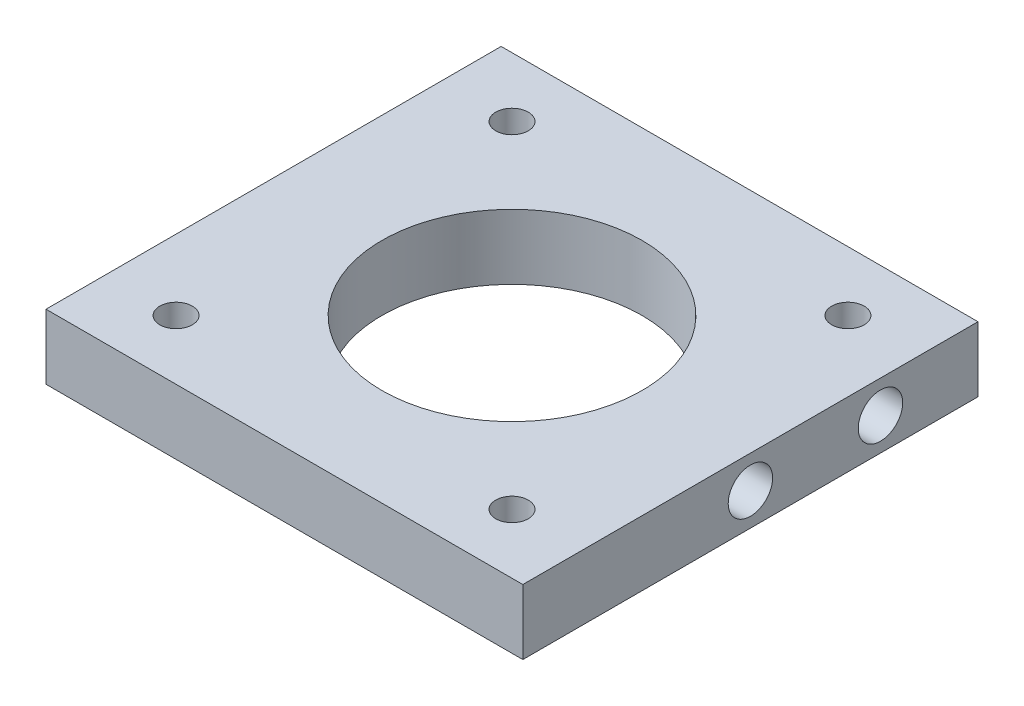
ISO-10303-21;
HEADER;
FILE_DESCRIPTION(('STEP AP214'),'2;1');
FILE_NAME('part.step','',(''),(''),'','','');
FILE_SCHEMA(('AUTOMOTIVE_DESIGN { 1 0 10303 214 1 1 1 1 }'));
ENDSEC;
DATA;
#1=APPLICATION_CONTEXT('core data for automotive mechanical design processes');
#2=APPLICATION_PROTOCOL_DEFINITION('international standard','automotive_design',2000,#1);
#3=PRODUCT_CONTEXT('',#1,'mechanical');
#4=PRODUCT('Part','Part','',(#3));
#5=PRODUCT_RELATED_PRODUCT_CATEGORY('part','',(#4));
#6=PRODUCT_DEFINITION_FORMATION('','',#4);
#7=PRODUCT_DEFINITION_CONTEXT('part definition',#1,'design');
#8=PRODUCT_DEFINITION('design','',#6,#7);
#9=PRODUCT_DEFINITION_SHAPE('','',#8);
#10=(LENGTH_UNIT() NAMED_UNIT(*) SI_UNIT(.MILLI.,.METRE.));
#11=(NAMED_UNIT(*) PLANE_ANGLE_UNIT() SI_UNIT($,.RADIAN.));
#12=(NAMED_UNIT(*) SI_UNIT($,.STERADIAN.) SOLID_ANGLE_UNIT());
#13=UNCERTAINTY_MEASURE_WITH_UNIT(LENGTH_MEASURE(1.E-05),#10,'distance_accuracy_value','');
#14=(GEOMETRIC_REPRESENTATION_CONTEXT(3) GLOBAL_UNCERTAINTY_ASSIGNED_CONTEXT((#13)) GLOBAL_UNIT_ASSIGNED_CONTEXT((#10,
#11,#12)) REPRESENTATION_CONTEXT('',''));
#15=CARTESIAN_POINT('',(0.,0.,0.));
#16=DIRECTION('',(0.,0.,1.));
#17=DIRECTION('',(1.,0.,0.));
#18=AXIS2_PLACEMENT_3D('',#15,#16,#17);
#19=CARTESIAN_POINT('',(-22.,3.,42.));
#20=DIRECTION('',(0.,1.,0.));
#21=DIRECTION('',(0.,0.,1.));
#22=AXIS2_PLACEMENT_3D('',#19,#20,#21);
#23=PLANE('',#22);
#24=CARTESIAN_POINT('',(-15.5,3.,36.5));
#25=DIRECTION('',(0.,1.,0.));
#26=DIRECTION('',(0.,0.,1.));
#27=AXIS2_PLACEMENT_3D('',#24,#25,#26);
#28=CIRCLE('',#27,1.5);
#29=CARTESIAN_POINT('',(-15.5,3.,38.));
#30=VERTEX_POINT('',#29);
#31=EDGE_CURVE('E146',#30,#30,#28,.T.);
#32=ORIENTED_EDGE('',*,*,#31,.F.);
#33=EDGE_LOOP('',(#32));
#34=FACE_BOUND('',#33,.T.);
#35=CARTESIAN_POINT('',(15.5,3.,36.5));
#36=DIRECTION('',(0.,1.,0.));
#37=DIRECTION('',(0.,0.,1.));
#38=AXIS2_PLACEMENT_3D('',#35,#36,#37);
#39=CIRCLE('',#38,1.5);
#40=CARTESIAN_POINT('',(15.5,3.,38.));
#41=VERTEX_POINT('',#40);
#42=EDGE_CURVE('E171',#41,#41,#39,.T.);
#43=ORIENTED_EDGE('',*,*,#42,.F.);
#44=EDGE_LOOP('',(#43));
#45=FACE_BOUND('',#44,.T.);
#46=CARTESIAN_POINT('',(15.5,3.,5.5));
#47=DIRECTION('',(0.,1.,0.));
#48=DIRECTION('',(0.,0.,1.));
#49=AXIS2_PLACEMENT_3D('',#46,#47,#48);
#50=CIRCLE('',#49,1.5);
#51=CARTESIAN_POINT('',(15.5,3.,7.));
#52=VERTEX_POINT('',#51);
#53=EDGE_CURVE('E165',#52,#52,#50,.T.);
#54=ORIENTED_EDGE('',*,*,#53,.F.);
#55=EDGE_LOOP('',(#54));
#56=FACE_BOUND('',#55,.T.);
#57=CARTESIAN_POINT('',(-15.5,3.,5.5));
#58=DIRECTION('',(0.,1.,0.));
#59=DIRECTION('',(0.,0.,1.));
#60=AXIS2_PLACEMENT_3D('',#57,#58,#59);
#61=CIRCLE('',#60,1.5);
#62=CARTESIAN_POINT('',(-15.5,3.,7.));
#63=VERTEX_POINT('',#62);
#64=EDGE_CURVE('E157',#63,#63,#61,.T.);
#65=ORIENTED_EDGE('',*,*,#64,.F.);
#66=EDGE_LOOP('',(#65));
#67=FACE_BOUND('',#66,.T.);
#68=CARTESIAN_POINT('',(0.,3.,21.));
#69=DIRECTION('',(0.,1.,0.));
#70=DIRECTION('',(0.,0.,1.));
#71=AXIS2_PLACEMENT_3D('',#68,#69,#70);
#72=CIRCLE('',#71,12.);
#73=CARTESIAN_POINT('',(0.,3.,33.));
#74=VERTEX_POINT('',#73);
#75=EDGE_CURVE('E164',#74,#74,#72,.T.);
#76=ORIENTED_EDGE('',*,*,#75,.F.);
#77=EDGE_LOOP('',(#76));
#78=FACE_BOUND('',#77,.T.);
#79=DIRECTION('',(1.,0.,0.));
#80=VECTOR('',#79,1.);
#81=CARTESIAN_POINT('',(-22.,3.,0.));
#82=LINE('',#81,#80);
#83=CARTESIAN_POINT('',(-22.,3.,0.));
#84=VERTEX_POINT('',#83);
#85=CARTESIAN_POINT('',(22.,3.,0.));
#86=VERTEX_POINT('',#85);
#87=EDGE_CURVE('E98',#84,#86,#82,.T.);
#88=ORIENTED_EDGE('',*,*,#87,.F.);
#89=DIRECTION('',(0.,0.,-1.));
#90=VECTOR('',#89,1.);
#91=CARTESIAN_POINT('',(-22.,3.,42.));
#92=LINE('',#91,#90);
#93=CARTESIAN_POINT('',(-22.,3.,42.));
#94=VERTEX_POINT('',#93);
#95=EDGE_CURVE('E11',#94,#84,#92,.T.);
#96=ORIENTED_EDGE('',*,*,#95,.F.);
#97=DIRECTION('',(1.,0.,0.));
#98=VECTOR('',#97,1.);
#99=CARTESIAN_POINT('',(-22.,3.,42.));
#100=LINE('',#99,#98);
#101=CARTESIAN_POINT('',(22.,3.,42.));
#102=VERTEX_POINT('',#101);
#103=EDGE_CURVE('E91',#94,#102,#100,.T.);
#104=ORIENTED_EDGE('',*,*,#103,.T.);
#105=DIRECTION('',(0.,0.,-1.));
#106=VECTOR('',#105,1.);
#107=CARTESIAN_POINT('',(22.,3.,42.));
#108=LINE('',#107,#106);
#109=EDGE_CURVE('E36',#102,#86,#108,.T.);
#110=ORIENTED_EDGE('',*,*,#109,.T.);
#111=EDGE_LOOP('',(#88,#96,#104,#110));
#112=FACE_BOUND('',#111,.T.);
#113=ADVANCED_FACE('F33',(#34,#45,#56,#67,#78,#112),#23,.T.);
#114=CARTESIAN_POINT('',(-22.,-3.,42.));
#115=DIRECTION('',(-1.,0.,0.));
#116=DIRECTION('',(0.,-1.,0.));
#117=AXIS2_PLACEMENT_3D('',#114,#115,#116);
#118=PLANE('',#117);
#119=CARTESIAN_POINT('',(-22.,0.,9.));
#120=DIRECTION('',(-1.,0.,0.));
#121=DIRECTION('',(0.,-1.,0.));
#122=AXIS2_PLACEMENT_3D('',#119,#120,#121);
#123=CIRCLE('',#122,2.05);
#124=CARTESIAN_POINT('',(-22.,-2.04999999999999,9.));
#125=VERTEX_POINT('',#124);
#126=EDGE_CURVE('E147',#125,#125,#123,.T.);
#127=ORIENTED_EDGE('',*,*,#126,.F.);
#128=EDGE_LOOP('',(#127));
#129=FACE_BOUND('',#128,.T.);
#130=CARTESIAN_POINT('',(-22.,0.,21.));
#131=DIRECTION('',(-1.,0.,0.));
#132=DIRECTION('',(0.,-1.,0.));
#133=AXIS2_PLACEMENT_3D('',#130,#131,#132);
#134=CIRCLE('',#133,2.05);
#135=CARTESIAN_POINT('',(-22.,-2.04999999999999,21.));
#136=VERTEX_POINT('',#135);
#137=EDGE_CURVE('E153',#136,#136,#134,.T.);
#138=ORIENTED_EDGE('',*,*,#137,.F.);
#139=EDGE_LOOP('',(#138));
#140=FACE_BOUND('',#139,.T.);
#141=DIRECTION('',(0.,1.,0.));
#142=VECTOR('',#141,1.);
#143=CARTESIAN_POINT('',(-22.,-3.,0.));
#144=LINE('',#143,#142);
#145=CARTESIAN_POINT('',(-22.,-3.,0.));
#146=VERTEX_POINT('',#145);
#147=EDGE_CURVE('E93',#146,#84,#144,.T.);
#148=ORIENTED_EDGE('',*,*,#147,.F.);
#149=DIRECTION('',(0.,0.,-1.));
#150=VECTOR('',#149,1.);
#151=CARTESIAN_POINT('',(-22.,-3.,42.));
#152=LINE('',#151,#150);
#153=CARTESIAN_POINT('',(-22.,-3.,42.));
#154=VERTEX_POINT('',#153);
#155=EDGE_CURVE('E42',#154,#146,#152,.T.);
#156=ORIENTED_EDGE('',*,*,#155,.F.);
#157=DIRECTION('',(0.,1.,0.));
#158=VECTOR('',#157,1.);
#159=CARTESIAN_POINT('',(-22.,-3.,42.));
#160=LINE('',#159,#158);
#161=EDGE_CURVE('E81',#154,#94,#160,.T.);
#162=ORIENTED_EDGE('',*,*,#161,.T.);
#163=ORIENTED_EDGE('',*,*,#95,.T.);
#164=EDGE_LOOP('',(#148,#156,#162,#163));
#165=FACE_BOUND('',#164,.T.);
#166=ADVANCED_FACE('F109',(#129,#140,#165),#118,.T.);
#167=CARTESIAN_POINT('',(-22.,-3.,42.));
#168=DIRECTION('',(0.,1.,0.));
#169=DIRECTION('',(0.,0.,1.));
#170=AXIS2_PLACEMENT_3D('',#167,#168,#169);
#171=PLANE('',#170);
#172=CARTESIAN_POINT('',(-15.5,-3.,36.5));
#173=DIRECTION('',(0.,1.,0.));
#174=DIRECTION('',(0.,0.,1.));
#175=AXIS2_PLACEMENT_3D('',#172,#173,#174);
#176=CIRCLE('',#175,1.5);
#177=CARTESIAN_POINT('',(-15.5,-3.,38.));
#178=VERTEX_POINT('',#177);
#179=EDGE_CURVE('E174',#178,#178,#176,.F.);
#180=ORIENTED_EDGE('',*,*,#179,.F.);
#181=EDGE_LOOP('',(#180));
#182=FACE_BOUND('',#181,.T.);
#183=CARTESIAN_POINT('',(15.5,-3.,36.5));
#184=DIRECTION('',(0.,1.,0.));
#185=DIRECTION('',(0.,0.,1.));
#186=AXIS2_PLACEMENT_3D('',#183,#184,#185);
#187=CIRCLE('',#186,1.5);
#188=CARTESIAN_POINT('',(15.5,-3.,38.));
#189=VERTEX_POINT('',#188);
#190=EDGE_CURVE('E168',#189,#189,#187,.F.);
#191=ORIENTED_EDGE('',*,*,#190,.F.);
#192=EDGE_LOOP('',(#191));
#193=FACE_BOUND('',#192,.T.);
#194=CARTESIAN_POINT('',(15.5,-3.,5.5));
#195=DIRECTION('',(0.,1.,0.));
#196=DIRECTION('',(0.,0.,1.));
#197=AXIS2_PLACEMENT_3D('',#194,#195,#196);
#198=CIRCLE('',#197,1.5);
#199=CARTESIAN_POINT('',(15.5,-3.,7.));
#200=VERTEX_POINT('',#199);
#201=EDGE_CURVE('E161',#200,#200,#198,.F.);
#202=ORIENTED_EDGE('',*,*,#201,.F.);
#203=EDGE_LOOP('',(#202));
#204=FACE_BOUND('',#203,.T.);
#205=CARTESIAN_POINT('',(-15.5,-3.,5.5));
#206=DIRECTION('',(0.,1.,0.));
#207=DIRECTION('',(0.,0.,1.));
#208=AXIS2_PLACEMENT_3D('',#205,#206,#207);
#209=CIRCLE('',#208,1.5);
#210=CARTESIAN_POINT('',(-15.5,-3.,7.));
#211=VERTEX_POINT('',#210);
#212=EDGE_CURVE('E160',#211,#211,#209,.F.);
#213=ORIENTED_EDGE('',*,*,#212,.F.);
#214=EDGE_LOOP('',(#213));
#215=FACE_BOUND('',#214,.T.);
#216=CARTESIAN_POINT('',(0.,-3.,21.));
#217=DIRECTION('',(0.,1.,0.));
#218=DIRECTION('',(0.,0.,1.));
#219=AXIS2_PLACEMENT_3D('',#216,#217,#218);
#220=CIRCLE('',#219,12.);
#221=CARTESIAN_POINT('',(0.,-3.,33.));
#222=VERTEX_POINT('',#221);
#223=EDGE_CURVE('E102',#222,#222,#220,.F.);
#224=ORIENTED_EDGE('',*,*,#223,.F.);
#225=EDGE_LOOP('',(#224));
#226=FACE_BOUND('',#225,.T.);
#227=DIRECTION('',(1.,0.,0.));
#228=VECTOR('',#227,1.);
#229=CARTESIAN_POINT('',(-22.,-3.,0.));
#230=LINE('',#229,#228);
#231=CARTESIAN_POINT('',(22.,-3.,0.));
#232=VERTEX_POINT('',#231);
#233=EDGE_CURVE('E86',#146,#232,#230,.T.);
#234=ORIENTED_EDGE('',*,*,#233,.T.);
#235=DIRECTION('',(0.,0.,-1.));
#236=VECTOR('',#235,1.);
#237=CARTESIAN_POINT('',(22.,-3.,42.));
#238=LINE('',#237,#236);
#239=CARTESIAN_POINT('',(22.,-3.,42.));
#240=VERTEX_POINT('',#239);
#241=EDGE_CURVE('E84',#240,#232,#238,.T.);
#242=ORIENTED_EDGE('',*,*,#241,.F.);
#243=DIRECTION('',(1.,0.,0.));
#244=VECTOR('',#243,1.);
#245=CARTESIAN_POINT('',(-22.,-3.,42.));
#246=LINE('',#245,#244);
#247=EDGE_CURVE('E78',#154,#240,#246,.T.);
#248=ORIENTED_EDGE('',*,*,#247,.F.);
#249=ORIENTED_EDGE('',*,*,#155,.T.);
#250=EDGE_LOOP('',(#234,#242,#248,#249));
#251=FACE_BOUND('',#250,.T.);
#252=ADVANCED_FACE('F85',(#182,#193,#204,#215,#226,#251),#171,.F.);
#253=CARTESIAN_POINT('',(22.,-3.,42.));
#254=DIRECTION('',(-1.,0.,0.));
#255=DIRECTION('',(0.,-1.,0.));
#256=AXIS2_PLACEMENT_3D('',#253,#254,#255);
#257=PLANE('',#256);
#258=CARTESIAN_POINT('',(22.,0.,9.));
#259=DIRECTION('',(1.,0.,0.));
#260=DIRECTION('',(0.,1.,0.));
#261=AXIS2_PLACEMENT_3D('',#258,#259,#260);
#262=CIRCLE('',#261,2.05);
#263=CARTESIAN_POINT('',(22.,2.04999999999999,9.));
#264=VERTEX_POINT('',#263);
#265=EDGE_CURVE('E132',#264,#264,#262,.T.);
#266=ORIENTED_EDGE('',*,*,#265,.F.);
#267=EDGE_LOOP('',(#266));
#268=FACE_BOUND('',#267,.T.);
#269=CARTESIAN_POINT('',(22.,0.,21.));
#270=DIRECTION('',(1.,0.,0.));
#271=DIRECTION('',(0.,1.,0.));
#272=AXIS2_PLACEMENT_3D('',#269,#270,#271);
#273=CIRCLE('',#272,2.05);
#274=CARTESIAN_POINT('',(22.,2.04999999999999,21.));
#275=VERTEX_POINT('',#274);
#276=EDGE_CURVE('E135',#275,#275,#273,.T.);
#277=ORIENTED_EDGE('',*,*,#276,.F.);
#278=EDGE_LOOP('',(#277));
#279=FACE_BOUND('',#278,.T.);
#280=DIRECTION('',(0.,1.,0.));
#281=VECTOR('',#280,1.);
#282=CARTESIAN_POINT('',(22.,-3.,0.));
#283=LINE('',#282,#281);
#284=EDGE_CURVE('E101',#232,#86,#283,.T.);
#285=ORIENTED_EDGE('',*,*,#284,.T.);
#286=ORIENTED_EDGE('',*,*,#109,.F.);
#287=DIRECTION('',(0.,1.,0.));
#288=VECTOR('',#287,1.);
#289=CARTESIAN_POINT('',(22.,-3.,42.));
#290=LINE('',#289,#288);
#291=EDGE_CURVE('E75',#240,#102,#290,.T.);
#292=ORIENTED_EDGE('',*,*,#291,.F.);
#293=ORIENTED_EDGE('',*,*,#241,.T.);
#294=EDGE_LOOP('',(#285,#286,#292,#293));
#295=FACE_BOUND('',#294,.T.);
#296=ADVANCED_FACE('F90',(#268,#279,#295),#257,.F.);
#297=CARTESIAN_POINT('',(0.,0.,42.));
#298=DIRECTION('',(0.,0.,1.));
#299=DIRECTION('',(1.,0.,0.));
#300=AXIS2_PLACEMENT_3D('',#297,#298,#299);
#301=PLANE('',#300);
#302=ORIENTED_EDGE('',*,*,#103,.F.);
#303=ORIENTED_EDGE('',*,*,#161,.F.);
#304=ORIENTED_EDGE('',*,*,#247,.T.);
#305=ORIENTED_EDGE('',*,*,#291,.T.);
#306=EDGE_LOOP('',(#302,#303,#304,#305));
#307=FACE_BOUND('',#306,.T.);
#308=ADVANCED_FACE('F80',(#307),#301,.T.);
#309=CARTESIAN_POINT('',(0.,0.,0.));
#310=DIRECTION('',(0.,0.,1.));
#311=DIRECTION('',(1.,0.,0.));
#312=AXIS2_PLACEMENT_3D('',#309,#310,#311);
#313=PLANE('',#312);
#314=ORIENTED_EDGE('',*,*,#87,.T.);
#315=ORIENTED_EDGE('',*,*,#284,.F.);
#316=ORIENTED_EDGE('',*,*,#233,.F.);
#317=ORIENTED_EDGE('',*,*,#147,.T.);
#318=EDGE_LOOP('',(#314,#315,#316,#317));
#319=FACE_BOUND('',#318,.T.);
#320=ADVANCED_FACE('F108',(#319),#313,.F.);
#321=CARTESIAN_POINT('',(0.,-3.001,21.));
#322=DIRECTION('',(0.,1.,0.));
#323=DIRECTION('',(0.,0.,1.));
#324=AXIS2_PLACEMENT_3D('',#321,#322,#323);
#325=CYLINDRICAL_SURFACE('',#324,12.);
#326=CARTESIAN_POINT('',(0.,3.,33.));
#327=CARTESIAN_POINT('',(0.,2.9375,33.));
#328=CARTESIAN_POINT('',(0.,2.875,33.));
#329=CARTESIAN_POINT('',(0.,2.75,33.));
#330=CARTESIAN_POINT('',(0.,2.6875,33.));
#331=CARTESIAN_POINT('',(0.,2.5625,33.));
#332=CARTESIAN_POINT('',(0.,2.5,33.));
#333=CARTESIAN_POINT('',(0.,2.375,33.));
#334=CARTESIAN_POINT('',(0.,2.3125,33.));
#335=CARTESIAN_POINT('',(0.,2.1875,33.));
#336=CARTESIAN_POINT('',(0.,2.125,33.));
#337=CARTESIAN_POINT('',(0.,2.,33.));
#338=CARTESIAN_POINT('',(0.,1.9375,33.));
#339=CARTESIAN_POINT('',(0.,1.8125,33.));
#340=CARTESIAN_POINT('',(0.,1.75,33.));
#341=CARTESIAN_POINT('',(0.,1.625,33.));
#342=CARTESIAN_POINT('',(0.,1.5625,33.));
#343=CARTESIAN_POINT('',(0.,1.4375,33.));
#344=CARTESIAN_POINT('',(0.,1.375,33.));
#345=CARTESIAN_POINT('',(0.,1.25,33.));
#346=CARTESIAN_POINT('',(0.,1.1875,33.));
#347=CARTESIAN_POINT('',(0.,1.0625,33.));
#348=CARTESIAN_POINT('',(0.,0.999999999999999,33.));
#349=CARTESIAN_POINT('',(0.,0.874999999999999,33.));
#350=CARTESIAN_POINT('',(0.,0.812499999999999,33.));
#351=CARTESIAN_POINT('',(0.,0.687499999999999,33.));
#352=CARTESIAN_POINT('',(0.,0.624999999999999,33.));
#353=CARTESIAN_POINT('',(0.,0.499999999999999,33.));
#354=CARTESIAN_POINT('',(0.,0.437499999999999,33.));
#355=CARTESIAN_POINT('',(0.,0.312499999999999,33.));
#356=CARTESIAN_POINT('',(0.,0.249999999999999,33.));
#357=CARTESIAN_POINT('',(0.,0.124999999999999,33.));
#358=CARTESIAN_POINT('',(0.,0.0624999999999992,33.));
#359=CARTESIAN_POINT('',(0.,-0.0625000000000009,33.));
#360=CARTESIAN_POINT('',(0.,-0.125000000000001,33.));
#361=CARTESIAN_POINT('',(0.,-0.250000000000001,33.));
#362=CARTESIAN_POINT('',(0.,-0.312500000000001,33.));
#363=CARTESIAN_POINT('',(0.,-0.437500000000001,33.));
#364=CARTESIAN_POINT('',(0.,-0.500000000000001,33.));
#365=CARTESIAN_POINT('',(0.,-0.625000000000001,33.));
#366=CARTESIAN_POINT('',(0.,-0.687500000000001,33.));
#367=CARTESIAN_POINT('',(0.,-0.812500000000001,33.));
#368=CARTESIAN_POINT('',(0.,-0.875000000000001,33.));
#369=CARTESIAN_POINT('',(0.,-1.,33.));
#370=CARTESIAN_POINT('',(0.,-1.0625,33.));
#371=CARTESIAN_POINT('',(0.,-1.1875,33.));
#372=CARTESIAN_POINT('',(0.,-1.25,33.));
#373=CARTESIAN_POINT('',(0.,-1.375,33.));
#374=CARTESIAN_POINT('',(0.,-1.4375,33.));
#375=CARTESIAN_POINT('',(0.,-1.5625,33.));
#376=CARTESIAN_POINT('',(0.,-1.625,33.));
#377=CARTESIAN_POINT('',(0.,-1.75,33.));
#378=CARTESIAN_POINT('',(0.,-1.8125,33.));
#379=CARTESIAN_POINT('',(0.,-1.9375,33.));
#380=CARTESIAN_POINT('',(0.,-2.,33.));
#381=CARTESIAN_POINT('',(0.,-2.125,33.));
#382=CARTESIAN_POINT('',(0.,-2.1875,33.));
#383=CARTESIAN_POINT('',(0.,-2.3125,33.));
#384=CARTESIAN_POINT('',(0.,-2.375,33.));
#385=CARTESIAN_POINT('',(0.,-2.5,33.));
#386=CARTESIAN_POINT('',(0.,-2.5625,33.));
#387=CARTESIAN_POINT('',(0.,-2.6875,33.));
#388=CARTESIAN_POINT('',(0.,-2.75,33.));
#389=CARTESIAN_POINT('',(0.,-2.875,33.));
#390=CARTESIAN_POINT('',(0.,-2.9375,33.));
#391=CARTESIAN_POINT('',(0.,-3.,33.));
#392=B_SPLINE_CURVE_WITH_KNOTS('',3,(#326,#327,#328,#329,#330,#331,#332,#333,#334,#335,#336,
#337,#338,#339,#340,#341,#342,#343,#344,#345,#346,#347,#348,#349,#350,#351,#352,#353,#354,#355,
#356,#357,#358,#359,#360,#361,#362,#363,#364,#365,#366,#367,#368,#369,#370,#371,#372,#373,#374,
#375,#376,#377,#378,#379,#380,#381,#382,#383,#384,#385,#386,#387,#388,#389,#390,#391),
.UNSPECIFIED.,.F.,.F.,(4,2,2,2,2,2,2,2,2,2,2,2,2,2,2,2,2,2,2,2,2,2,2,2,2,2,2,2,2,2,2,2,4),(0.,
0.1875,0.375,0.5625,0.75,0.9375,1.125,1.3125,1.5,1.6875,1.875,2.0625,2.25,2.4375,2.625,2.8125,
3.,3.1875,3.375,3.5625,3.75,3.9375,4.125,4.3125,4.5,4.6875,4.875,5.0625,5.25,5.4375,5.625,
5.8125,6.),.UNSPECIFIED.);
#393=EDGE_CURVE('BSEAM185',#74,#222,#392,.T.);
#394=ORIENTED_EDGE('',*,*,#75,.T.);
#395=ORIENTED_EDGE('',*,*,#223,.T.);
#396=ORIENTED_EDGE('',*,*,#393,.T.);
#397=ORIENTED_EDGE('',*,*,#393,.F.);
#398=EDGE_LOOP('',(#394,#396,#395,#397));
#399=FACE_BOUND('',#398,.T.);
#400=ADVANCED_FACE('F185',(#399),#325,.F.);
#401=CARTESIAN_POINT('',(-15.5,-3.001,5.5));
#402=DIRECTION('',(0.,1.,0.));
#403=DIRECTION('',(0.,0.,1.));
#404=AXIS2_PLACEMENT_3D('',#401,#402,#403);
#405=CYLINDRICAL_SURFACE('',#404,1.5);
#406=CARTESIAN_POINT('',(-15.5,3.,7.));
#407=CARTESIAN_POINT('',(-15.5,2.9375,7.));
#408=CARTESIAN_POINT('',(-15.5,2.875,7.));
#409=CARTESIAN_POINT('',(-15.5,2.75,7.));
#410=CARTESIAN_POINT('',(-15.5,2.6875,7.));
#411=CARTESIAN_POINT('',(-15.5,2.5625,7.));
#412=CARTESIAN_POINT('',(-15.5,2.5,7.));
#413=CARTESIAN_POINT('',(-15.5,2.375,7.));
#414=CARTESIAN_POINT('',(-15.5,2.3125,7.));
#415=CARTESIAN_POINT('',(-15.5,2.1875,7.));
#416=CARTESIAN_POINT('',(-15.5,2.125,7.));
#417=CARTESIAN_POINT('',(-15.5,2.,7.));
#418=CARTESIAN_POINT('',(-15.5,1.9375,7.));
#419=CARTESIAN_POINT('',(-15.5,1.8125,7.));
#420=CARTESIAN_POINT('',(-15.5,1.75,7.));
#421=CARTESIAN_POINT('',(-15.5,1.625,7.));
#422=CARTESIAN_POINT('',(-15.5,1.5625,7.));
#423=CARTESIAN_POINT('',(-15.5,1.4375,7.));
#424=CARTESIAN_POINT('',(-15.5,1.375,7.));
#425=CARTESIAN_POINT('',(-15.5,1.25,7.));
#426=CARTESIAN_POINT('',(-15.5,1.1875,7.));
#427=CARTESIAN_POINT('',(-15.5,1.0625,7.));
#428=CARTESIAN_POINT('',(-15.5,0.999999999999999,7.));
#429=CARTESIAN_POINT('',(-15.5,0.874999999999999,7.));
#430=CARTESIAN_POINT('',(-15.5,0.812499999999999,7.));
#431=CARTESIAN_POINT('',(-15.5,0.687499999999999,7.));
#432=CARTESIAN_POINT('',(-15.5,0.624999999999999,7.));
#433=CARTESIAN_POINT('',(-15.5,0.499999999999999,7.));
#434=CARTESIAN_POINT('',(-15.5,0.437499999999999,7.));
#435=CARTESIAN_POINT('',(-15.5,0.312499999999999,7.));
#436=CARTESIAN_POINT('',(-15.5,0.249999999999999,7.));
#437=CARTESIAN_POINT('',(-15.5,0.124999999999999,7.));
#438=CARTESIAN_POINT('',(-15.5,0.0624999999999992,7.));
#439=CARTESIAN_POINT('',(-15.5,-0.0625000000000009,7.));
#440=CARTESIAN_POINT('',(-15.5,-0.125000000000001,7.));
#441=CARTESIAN_POINT('',(-15.5,-0.250000000000001,7.));
#442=CARTESIAN_POINT('',(-15.5,-0.312500000000001,7.));
#443=CARTESIAN_POINT('',(-15.5,-0.437500000000001,7.));
#444=CARTESIAN_POINT('',(-15.5,-0.500000000000001,7.));
#445=CARTESIAN_POINT('',(-15.5,-0.625000000000001,7.));
#446=CARTESIAN_POINT('',(-15.5,-0.687500000000001,7.));
#447=CARTESIAN_POINT('',(-15.5,-0.812500000000001,7.));
#448=CARTESIAN_POINT('',(-15.5,-0.875000000000001,7.));
#449=CARTESIAN_POINT('',(-15.5,-1.,7.));
#450=CARTESIAN_POINT('',(-15.5,-1.0625,7.));
#451=CARTESIAN_POINT('',(-15.5,-1.1875,7.));
#452=CARTESIAN_POINT('',(-15.5,-1.25,7.));
#453=CARTESIAN_POINT('',(-15.5,-1.375,7.));
#454=CARTESIAN_POINT('',(-15.5,-1.4375,7.));
#455=CARTESIAN_POINT('',(-15.5,-1.5625,7.));
#456=CARTESIAN_POINT('',(-15.5,-1.625,7.));
#457=CARTESIAN_POINT('',(-15.5,-1.75,7.));
#458=CARTESIAN_POINT('',(-15.5,-1.8125,7.));
#459=CARTESIAN_POINT('',(-15.5,-1.9375,7.));
#460=CARTESIAN_POINT('',(-15.5,-2.,7.));
#461=CARTESIAN_POINT('',(-15.5,-2.125,7.));
#462=CARTESIAN_POINT('',(-15.5,-2.1875,7.));
#463=CARTESIAN_POINT('',(-15.5,-2.3125,7.));
#464=CARTESIAN_POINT('',(-15.5,-2.375,7.));
#465=CARTESIAN_POINT('',(-15.5,-2.5,7.));
#466=CARTESIAN_POINT('',(-15.5,-2.5625,7.));
#467=CARTESIAN_POINT('',(-15.5,-2.6875,7.));
#468=CARTESIAN_POINT('',(-15.5,-2.75,7.));
#469=CARTESIAN_POINT('',(-15.5,-2.875,7.));
#470=CARTESIAN_POINT('',(-15.5,-2.9375,7.));
#471=CARTESIAN_POINT('',(-15.5,-3.,7.));
#472=B_SPLINE_CURVE_WITH_KNOTS('',3,(#406,#407,#408,#409,#410,#411,#412,#413,#414,#415,#416,
#417,#418,#419,#420,#421,#422,#423,#424,#425,#426,#427,#428,#429,#430,#431,#432,#433,#434,#435,
#436,#437,#438,#439,#440,#441,#442,#443,#444,#445,#446,#447,#448,#449,#450,#451,#452,#453,#454,
#455,#456,#457,#458,#459,#460,#461,#462,#463,#464,#465,#466,#467,#468,#469,#470,#471),
.UNSPECIFIED.,.F.,.F.,(4,2,2,2,2,2,2,2,2,2,2,2,2,2,2,2,2,2,2,2,2,2,2,2,2,2,2,2,2,2,2,2,4),(0.,
0.1875,0.375,0.5625,0.75,0.9375,1.125,1.3125,1.5,1.6875,1.875,2.0625,2.25,2.4375,2.625,2.8125,
3.,3.1875,3.375,3.5625,3.75,3.9375,4.125,4.3125,4.5,4.6875,4.875,5.0625,5.25,5.4375,5.625,
5.8125,6.),.UNSPECIFIED.);
#473=EDGE_CURVE('BSEAM188',#63,#211,#472,.T.);
#474=ORIENTED_EDGE('',*,*,#64,.T.);
#475=ORIENTED_EDGE('',*,*,#212,.T.);
#476=ORIENTED_EDGE('',*,*,#473,.T.);
#477=ORIENTED_EDGE('',*,*,#473,.F.);
#478=EDGE_LOOP('',(#474,#476,#475,#477));
#479=FACE_BOUND('',#478,.T.);
#480=ADVANCED_FACE('F188',(#479),#405,.F.);
#481=CARTESIAN_POINT('',(15.5,-3.001,5.5));
#482=DIRECTION('',(0.,1.,0.));
#483=DIRECTION('',(0.,0.,1.));
#484=AXIS2_PLACEMENT_3D('',#481,#482,#483);
#485=CYLINDRICAL_SURFACE('',#484,1.5);
#486=CARTESIAN_POINT('',(15.5,3.,7.));
#487=CARTESIAN_POINT('',(15.5,2.9375,7.));
#488=CARTESIAN_POINT('',(15.5,2.875,7.));
#489=CARTESIAN_POINT('',(15.5,2.75,7.));
#490=CARTESIAN_POINT('',(15.5,2.6875,7.));
#491=CARTESIAN_POINT('',(15.5,2.5625,7.));
#492=CARTESIAN_POINT('',(15.5,2.5,7.));
#493=CARTESIAN_POINT('',(15.5,2.375,7.));
#494=CARTESIAN_POINT('',(15.5,2.3125,7.));
#495=CARTESIAN_POINT('',(15.5,2.1875,7.));
#496=CARTESIAN_POINT('',(15.5,2.125,7.));
#497=CARTESIAN_POINT('',(15.5,2.,7.));
#498=CARTESIAN_POINT('',(15.5,1.9375,7.));
#499=CARTESIAN_POINT('',(15.5,1.8125,7.));
#500=CARTESIAN_POINT('',(15.5,1.75,7.));
#501=CARTESIAN_POINT('',(15.5,1.625,7.));
#502=CARTESIAN_POINT('',(15.5,1.5625,7.));
#503=CARTESIAN_POINT('',(15.5,1.4375,7.));
#504=CARTESIAN_POINT('',(15.5,1.375,7.));
#505=CARTESIAN_POINT('',(15.5,1.25,7.));
#506=CARTESIAN_POINT('',(15.5,1.1875,7.));
#507=CARTESIAN_POINT('',(15.5,1.0625,7.));
#508=CARTESIAN_POINT('',(15.5,0.999999999999999,7.));
#509=CARTESIAN_POINT('',(15.5,0.874999999999999,7.));
#510=CARTESIAN_POINT('',(15.5,0.812499999999999,7.));
#511=CARTESIAN_POINT('',(15.5,0.687499999999999,7.));
#512=CARTESIAN_POINT('',(15.5,0.624999999999999,7.));
#513=CARTESIAN_POINT('',(15.5,0.499999999999999,7.));
#514=CARTESIAN_POINT('',(15.5,0.437499999999999,7.));
#515=CARTESIAN_POINT('',(15.5,0.312499999999999,7.));
#516=CARTESIAN_POINT('',(15.5,0.249999999999999,7.));
#517=CARTESIAN_POINT('',(15.5,0.124999999999999,7.));
#518=CARTESIAN_POINT('',(15.5,0.0624999999999992,7.));
#519=CARTESIAN_POINT('',(15.5,-0.0625000000000009,7.));
#520=CARTESIAN_POINT('',(15.5,-0.125000000000001,7.));
#521=CARTESIAN_POINT('',(15.5,-0.250000000000001,7.));
#522=CARTESIAN_POINT('',(15.5,-0.312500000000001,7.));
#523=CARTESIAN_POINT('',(15.5,-0.437500000000001,7.));
#524=CARTESIAN_POINT('',(15.5,-0.500000000000001,7.));
#525=CARTESIAN_POINT('',(15.5,-0.625000000000001,7.));
#526=CARTESIAN_POINT('',(15.5,-0.687500000000001,7.));
#527=CARTESIAN_POINT('',(15.5,-0.812500000000001,7.));
#528=CARTESIAN_POINT('',(15.5,-0.875000000000001,7.));
#529=CARTESIAN_POINT('',(15.5,-1.,7.));
#530=CARTESIAN_POINT('',(15.5,-1.0625,7.));
#531=CARTESIAN_POINT('',(15.5,-1.1875,7.));
#532=CARTESIAN_POINT('',(15.5,-1.25,7.));
#533=CARTESIAN_POINT('',(15.5,-1.375,7.));
#534=CARTESIAN_POINT('',(15.5,-1.4375,7.));
#535=CARTESIAN_POINT('',(15.5,-1.5625,7.));
#536=CARTESIAN_POINT('',(15.5,-1.625,7.));
#537=CARTESIAN_POINT('',(15.5,-1.75,7.));
#538=CARTESIAN_POINT('',(15.5,-1.8125,7.));
#539=CARTESIAN_POINT('',(15.5,-1.9375,7.));
#540=CARTESIAN_POINT('',(15.5,-2.,7.));
#541=CARTESIAN_POINT('',(15.5,-2.125,7.));
#542=CARTESIAN_POINT('',(15.5,-2.1875,7.));
#543=CARTESIAN_POINT('',(15.5,-2.3125,7.));
#544=CARTESIAN_POINT('',(15.5,-2.375,7.));
#545=CARTESIAN_POINT('',(15.5,-2.5,7.));
#546=CARTESIAN_POINT('',(15.5,-2.5625,7.));
#547=CARTESIAN_POINT('',(15.5,-2.6875,7.));
#548=CARTESIAN_POINT('',(15.5,-2.75,7.));
#549=CARTESIAN_POINT('',(15.5,-2.875,7.));
#550=CARTESIAN_POINT('',(15.5,-2.9375,7.));
#551=CARTESIAN_POINT('',(15.5,-3.,7.));
#552=B_SPLINE_CURVE_WITH_KNOTS('',3,(#486,#487,#488,#489,#490,#491,#492,#493,#494,#495,#496,
#497,#498,#499,#500,#501,#502,#503,#504,#505,#506,#507,#508,#509,#510,#511,#512,#513,#514,#515,
#516,#517,#518,#519,#520,#521,#522,#523,#524,#525,#526,#527,#528,#529,#530,#531,#532,#533,#534,
#535,#536,#537,#538,#539,#540,#541,#542,#543,#544,#545,#546,#547,#548,#549,#550,#551),
.UNSPECIFIED.,.F.,.F.,(4,2,2,2,2,2,2,2,2,2,2,2,2,2,2,2,2,2,2,2,2,2,2,2,2,2,2,2,2,2,2,2,4),(0.,
0.1875,0.375,0.5625,0.75,0.9375,1.125,1.3125,1.5,1.6875,1.875,2.0625,2.25,2.4375,2.625,2.8125,
3.,3.1875,3.375,3.5625,3.75,3.9375,4.125,4.3125,4.5,4.6875,4.875,5.0625,5.25,5.4375,5.625,
5.8125,6.),.UNSPECIFIED.);
#553=EDGE_CURVE('BSEAM195',#52,#200,#552,.T.);
#554=ORIENTED_EDGE('',*,*,#53,.T.);
#555=ORIENTED_EDGE('',*,*,#201,.T.);
#556=ORIENTED_EDGE('',*,*,#553,.T.);
#557=ORIENTED_EDGE('',*,*,#553,.F.);
#558=EDGE_LOOP('',(#554,#556,#555,#557));
#559=FACE_BOUND('',#558,.T.);
#560=ADVANCED_FACE('F195',(#559),#485,.F.);
#561=CARTESIAN_POINT('',(15.5,-3.001,36.5));
#562=DIRECTION('',(0.,1.,0.));
#563=DIRECTION('',(0.,0.,1.));
#564=AXIS2_PLACEMENT_3D('',#561,#562,#563);
#565=CYLINDRICAL_SURFACE('',#564,1.5);
#566=CARTESIAN_POINT('',(15.5,3.,38.));
#567=CARTESIAN_POINT('',(15.5,2.9375,38.));
#568=CARTESIAN_POINT('',(15.5,2.875,38.));
#569=CARTESIAN_POINT('',(15.5,2.75,38.));
#570=CARTESIAN_POINT('',(15.5,2.6875,38.));
#571=CARTESIAN_POINT('',(15.5,2.5625,38.));
#572=CARTESIAN_POINT('',(15.5,2.5,38.));
#573=CARTESIAN_POINT('',(15.5,2.375,38.));
#574=CARTESIAN_POINT('',(15.5,2.3125,38.));
#575=CARTESIAN_POINT('',(15.5,2.1875,38.));
#576=CARTESIAN_POINT('',(15.5,2.125,38.));
#577=CARTESIAN_POINT('',(15.5,2.,38.));
#578=CARTESIAN_POINT('',(15.5,1.9375,38.));
#579=CARTESIAN_POINT('',(15.5,1.8125,38.));
#580=CARTESIAN_POINT('',(15.5,1.75,38.));
#581=CARTESIAN_POINT('',(15.5,1.625,38.));
#582=CARTESIAN_POINT('',(15.5,1.5625,38.));
#583=CARTESIAN_POINT('',(15.5,1.4375,38.));
#584=CARTESIAN_POINT('',(15.5,1.375,38.));
#585=CARTESIAN_POINT('',(15.5,1.25,38.));
#586=CARTESIAN_POINT('',(15.5,1.1875,38.));
#587=CARTESIAN_POINT('',(15.5,1.0625,38.));
#588=CARTESIAN_POINT('',(15.5,0.999999999999999,38.));
#589=CARTESIAN_POINT('',(15.5,0.874999999999999,38.));
#590=CARTESIAN_POINT('',(15.5,0.812499999999999,38.));
#591=CARTESIAN_POINT('',(15.5,0.687499999999999,38.));
#592=CARTESIAN_POINT('',(15.5,0.624999999999999,38.));
#593=CARTESIAN_POINT('',(15.5,0.499999999999999,38.));
#594=CARTESIAN_POINT('',(15.5,0.437499999999999,38.));
#595=CARTESIAN_POINT('',(15.5,0.312499999999999,38.));
#596=CARTESIAN_POINT('',(15.5,0.249999999999999,38.));
#597=CARTESIAN_POINT('',(15.5,0.124999999999999,38.));
#598=CARTESIAN_POINT('',(15.5,0.0624999999999992,38.));
#599=CARTESIAN_POINT('',(15.5,-0.0625000000000009,38.));
#600=CARTESIAN_POINT('',(15.5,-0.125000000000001,38.));
#601=CARTESIAN_POINT('',(15.5,-0.250000000000001,38.));
#602=CARTESIAN_POINT('',(15.5,-0.312500000000001,38.));
#603=CARTESIAN_POINT('',(15.5,-0.437500000000001,38.));
#604=CARTESIAN_POINT('',(15.5,-0.500000000000001,38.));
#605=CARTESIAN_POINT('',(15.5,-0.625000000000001,38.));
#606=CARTESIAN_POINT('',(15.5,-0.687500000000001,38.));
#607=CARTESIAN_POINT('',(15.5,-0.812500000000001,38.));
#608=CARTESIAN_POINT('',(15.5,-0.875000000000001,38.));
#609=CARTESIAN_POINT('',(15.5,-1.,38.));
#610=CARTESIAN_POINT('',(15.5,-1.0625,38.));
#611=CARTESIAN_POINT('',(15.5,-1.1875,38.));
#612=CARTESIAN_POINT('',(15.5,-1.25,38.));
#613=CARTESIAN_POINT('',(15.5,-1.375,38.));
#614=CARTESIAN_POINT('',(15.5,-1.4375,38.));
#615=CARTESIAN_POINT('',(15.5,-1.5625,38.));
#616=CARTESIAN_POINT('',(15.5,-1.625,38.));
#617=CARTESIAN_POINT('',(15.5,-1.75,38.));
#618=CARTESIAN_POINT('',(15.5,-1.8125,38.));
#619=CARTESIAN_POINT('',(15.5,-1.9375,38.));
#620=CARTESIAN_POINT('',(15.5,-2.,38.));
#621=CARTESIAN_POINT('',(15.5,-2.125,38.));
#622=CARTESIAN_POINT('',(15.5,-2.1875,38.));
#623=CARTESIAN_POINT('',(15.5,-2.3125,38.));
#624=CARTESIAN_POINT('',(15.5,-2.375,38.));
#625=CARTESIAN_POINT('',(15.5,-2.5,38.));
#626=CARTESIAN_POINT('',(15.5,-2.5625,38.));
#627=CARTESIAN_POINT('',(15.5,-2.6875,38.));
#628=CARTESIAN_POINT('',(15.5,-2.75,38.));
#629=CARTESIAN_POINT('',(15.5,-2.875,38.));
#630=CARTESIAN_POINT('',(15.5,-2.9375,38.));
#631=CARTESIAN_POINT('',(15.5,-3.,38.));
#632=B_SPLINE_CURVE_WITH_KNOTS('',3,(#566,#567,#568,#569,#570,#571,#572,#573,#574,#575,#576,
#577,#578,#579,#580,#581,#582,#583,#584,#585,#586,#587,#588,#589,#590,#591,#592,#593,#594,#595,
#596,#597,#598,#599,#600,#601,#602,#603,#604,#605,#606,#607,#608,#609,#610,#611,#612,#613,#614,
#615,#616,#617,#618,#619,#620,#621,#622,#623,#624,#625,#626,#627,#628,#629,#630,#631),
.UNSPECIFIED.,.F.,.F.,(4,2,2,2,2,2,2,2,2,2,2,2,2,2,2,2,2,2,2,2,2,2,2,2,2,2,2,2,2,2,2,2,4),(0.,
0.1875,0.375,0.5625,0.75,0.9375,1.125,1.3125,1.5,1.6875,1.875,2.0625,2.25,2.4375,2.625,2.8125,
3.,3.1875,3.375,3.5625,3.75,3.9375,4.125,4.3125,4.5,4.6875,4.875,5.0625,5.25,5.4375,5.625,
5.8125,6.),.UNSPECIFIED.);
#633=EDGE_CURVE('BSEAM203',#41,#189,#632,.T.);
#634=ORIENTED_EDGE('',*,*,#42,.T.);
#635=ORIENTED_EDGE('',*,*,#190,.T.);
#636=ORIENTED_EDGE('',*,*,#633,.T.);
#637=ORIENTED_EDGE('',*,*,#633,.F.);
#638=EDGE_LOOP('',(#634,#636,#635,#637));
#639=FACE_BOUND('',#638,.T.);
#640=ADVANCED_FACE('F203',(#639),#565,.F.);
#641=CARTESIAN_POINT('',(-15.5,-3.001,36.5));
#642=DIRECTION('',(0.,1.,0.));
#643=DIRECTION('',(0.,0.,1.));
#644=AXIS2_PLACEMENT_3D('',#641,#642,#643);
#645=CYLINDRICAL_SURFACE('',#644,1.5);
#646=CARTESIAN_POINT('',(-15.5,3.,38.));
#647=CARTESIAN_POINT('',(-15.5,2.9375,38.));
#648=CARTESIAN_POINT('',(-15.5,2.875,38.));
#649=CARTESIAN_POINT('',(-15.5,2.75,38.));
#650=CARTESIAN_POINT('',(-15.5,2.6875,38.));
#651=CARTESIAN_POINT('',(-15.5,2.5625,38.));
#652=CARTESIAN_POINT('',(-15.5,2.5,38.));
#653=CARTESIAN_POINT('',(-15.5,2.375,38.));
#654=CARTESIAN_POINT('',(-15.5,2.3125,38.));
#655=CARTESIAN_POINT('',(-15.5,2.1875,38.));
#656=CARTESIAN_POINT('',(-15.5,2.125,38.));
#657=CARTESIAN_POINT('',(-15.5,2.,38.));
#658=CARTESIAN_POINT('',(-15.5,1.9375,38.));
#659=CARTESIAN_POINT('',(-15.5,1.8125,38.));
#660=CARTESIAN_POINT('',(-15.5,1.75,38.));
#661=CARTESIAN_POINT('',(-15.5,1.625,38.));
#662=CARTESIAN_POINT('',(-15.5,1.5625,38.));
#663=CARTESIAN_POINT('',(-15.5,1.4375,38.));
#664=CARTESIAN_POINT('',(-15.5,1.375,38.));
#665=CARTESIAN_POINT('',(-15.5,1.25,38.));
#666=CARTESIAN_POINT('',(-15.5,1.1875,38.));
#667=CARTESIAN_POINT('',(-15.5,1.0625,38.));
#668=CARTESIAN_POINT('',(-15.5,0.999999999999999,38.));
#669=CARTESIAN_POINT('',(-15.5,0.874999999999999,38.));
#670=CARTESIAN_POINT('',(-15.5,0.812499999999999,38.));
#671=CARTESIAN_POINT('',(-15.5,0.687499999999999,38.));
#672=CARTESIAN_POINT('',(-15.5,0.624999999999999,38.));
#673=CARTESIAN_POINT('',(-15.5,0.499999999999999,38.));
#674=CARTESIAN_POINT('',(-15.5,0.437499999999999,38.));
#675=CARTESIAN_POINT('',(-15.5,0.312499999999999,38.));
#676=CARTESIAN_POINT('',(-15.5,0.249999999999999,38.));
#677=CARTESIAN_POINT('',(-15.5,0.124999999999999,38.));
#678=CARTESIAN_POINT('',(-15.5,0.0624999999999992,38.));
#679=CARTESIAN_POINT('',(-15.5,-0.0625000000000009,38.));
#680=CARTESIAN_POINT('',(-15.5,-0.125000000000001,38.));
#681=CARTESIAN_POINT('',(-15.5,-0.250000000000001,38.));
#682=CARTESIAN_POINT('',(-15.5,-0.312500000000001,38.));
#683=CARTESIAN_POINT('',(-15.5,-0.437500000000001,38.));
#684=CARTESIAN_POINT('',(-15.5,-0.500000000000001,38.));
#685=CARTESIAN_POINT('',(-15.5,-0.625000000000001,38.));
#686=CARTESIAN_POINT('',(-15.5,-0.687500000000001,38.));
#687=CARTESIAN_POINT('',(-15.5,-0.812500000000001,38.));
#688=CARTESIAN_POINT('',(-15.5,-0.875000000000001,38.));
#689=CARTESIAN_POINT('',(-15.5,-1.,38.));
#690=CARTESIAN_POINT('',(-15.5,-1.0625,38.));
#691=CARTESIAN_POINT('',(-15.5,-1.1875,38.));
#692=CARTESIAN_POINT('',(-15.5,-1.25,38.));
#693=CARTESIAN_POINT('',(-15.5,-1.375,38.));
#694=CARTESIAN_POINT('',(-15.5,-1.4375,38.));
#695=CARTESIAN_POINT('',(-15.5,-1.5625,38.));
#696=CARTESIAN_POINT('',(-15.5,-1.625,38.));
#697=CARTESIAN_POINT('',(-15.5,-1.75,38.));
#698=CARTESIAN_POINT('',(-15.5,-1.8125,38.));
#699=CARTESIAN_POINT('',(-15.5,-1.9375,38.));
#700=CARTESIAN_POINT('',(-15.5,-2.,38.));
#701=CARTESIAN_POINT('',(-15.5,-2.125,38.));
#702=CARTESIAN_POINT('',(-15.5,-2.1875,38.));
#703=CARTESIAN_POINT('',(-15.5,-2.3125,38.));
#704=CARTESIAN_POINT('',(-15.5,-2.375,38.));
#705=CARTESIAN_POINT('',(-15.5,-2.5,38.));
#706=CARTESIAN_POINT('',(-15.5,-2.5625,38.));
#707=CARTESIAN_POINT('',(-15.5,-2.6875,38.));
#708=CARTESIAN_POINT('',(-15.5,-2.75,38.));
#709=CARTESIAN_POINT('',(-15.5,-2.875,38.));
#710=CARTESIAN_POINT('',(-15.5,-2.9375,38.));
#711=CARTESIAN_POINT('',(-15.5,-3.,38.));
#712=B_SPLINE_CURVE_WITH_KNOTS('',3,(#646,#647,#648,#649,#650,#651,#652,#653,#654,#655,#656,
#657,#658,#659,#660,#661,#662,#663,#664,#665,#666,#667,#668,#669,#670,#671,#672,#673,#674,#675,
#676,#677,#678,#679,#680,#681,#682,#683,#684,#685,#686,#687,#688,#689,#690,#691,#692,#693,#694,
#695,#696,#697,#698,#699,#700,#701,#702,#703,#704,#705,#706,#707,#708,#709,#710,#711),
.UNSPECIFIED.,.F.,.F.,(4,2,2,2,2,2,2,2,2,2,2,2,2,2,2,2,2,2,2,2,2,2,2,2,2,2,2,2,2,2,2,2,4),(0.,
0.1875,0.375,0.5625,0.75,0.9375,1.125,1.3125,1.5,1.6875,1.875,2.0625,2.25,2.4375,2.625,2.8125,
3.,3.1875,3.375,3.5625,3.75,3.9375,4.125,4.3125,4.5,4.6875,4.875,5.0625,5.25,5.4375,5.625,
5.8125,6.),.UNSPECIFIED.);
#713=EDGE_CURVE('BSEAM199',#30,#178,#712,.T.);
#714=ORIENTED_EDGE('',*,*,#31,.T.);
#715=ORIENTED_EDGE('',*,*,#179,.T.);
#716=ORIENTED_EDGE('',*,*,#713,.T.);
#717=ORIENTED_EDGE('',*,*,#713,.F.);
#718=EDGE_LOOP('',(#714,#716,#715,#717));
#719=FACE_BOUND('',#718,.T.);
#720=ADVANCED_FACE('F199',(#719),#645,.F.);
#721=CARTESIAN_POINT('',(-16.,0.,21.));
#722=DIRECTION('',(-1.,0.,0.));
#723=DIRECTION('',(0.,-1.,0.));
#724=AXIS2_PLACEMENT_3D('',#721,#722,#723);
#725=CYLINDRICAL_SURFACE('',#724,2.05);
#726=CARTESIAN_POINT('',(-16.,0.,21.));
#727=DIRECTION('',(-1.,0.,0.));
#728=DIRECTION('',(0.,-1.,0.));
#729=AXIS2_PLACEMENT_3D('',#726,#727,#728);
#730=CIRCLE('',#729,2.05);
#731=CARTESIAN_POINT('',(-16.,-2.04999999999998,21.));
#732=VERTEX_POINT('',#731);
#733=EDGE_CURVE('E150',#732,#732,#730,.T.);
#734=ORIENTED_EDGE('',*,*,#733,.F.);
#735=EDGE_LOOP('',(#734));
#736=FACE_BOUND('',#735,.T.);
#737=ORIENTED_EDGE('',*,*,#137,.T.);
#738=EDGE_LOOP('',(#737));
#739=FACE_BOUND('',#738,.T.);
#740=ADVANCED_FACE('F202',(#736,#739),#725,.F.);
#741=CARTESIAN_POINT('',(-16.,0.,21.));
#742=DIRECTION('',(-1.,0.,0.));
#743=DIRECTION('',(0.,-1.,0.));
#744=AXIS2_PLACEMENT_3D('',#741,#742,#743);
#745=PLANE('',#744);
#746=ORIENTED_EDGE('',*,*,#733,.T.);
#747=EDGE_LOOP('',(#746));
#748=FACE_BOUND('',#747,.T.);
#749=ADVANCED_FACE('F213',(#748),#745,.T.);
#750=CARTESIAN_POINT('',(-16.,0.,9.));
#751=DIRECTION('',(-1.,0.,0.));
#752=DIRECTION('',(0.,-1.,0.));
#753=AXIS2_PLACEMENT_3D('',#750,#751,#752);
#754=CYLINDRICAL_SURFACE('',#753,2.05);
#755=CARTESIAN_POINT('',(-16.,0.,9.));
#756=DIRECTION('',(-1.,0.,0.));
#757=DIRECTION('',(0.,-1.,0.));
#758=AXIS2_PLACEMENT_3D('',#755,#756,#757);
#759=CIRCLE('',#758,2.05);
#760=CARTESIAN_POINT('',(-16.,-2.04999999999998,9.));
#761=VERTEX_POINT('',#760);
#762=EDGE_CURVE('E143',#761,#761,#759,.T.);
#763=ORIENTED_EDGE('',*,*,#762,.F.);
#764=EDGE_LOOP('',(#763));
#765=FACE_BOUND('',#764,.T.);
#766=ORIENTED_EDGE('',*,*,#126,.T.);
#767=EDGE_LOOP('',(#766));
#768=FACE_BOUND('',#767,.T.);
#769=ADVANCED_FACE('F217',(#765,#768),#754,.F.);
#770=CARTESIAN_POINT('',(-16.,0.,9.));
#771=DIRECTION('',(-1.,0.,0.));
#772=DIRECTION('',(0.,-1.,0.));
#773=AXIS2_PLACEMENT_3D('',#770,#771,#772);
#774=PLANE('',#773);
#775=ORIENTED_EDGE('',*,*,#762,.T.);
#776=EDGE_LOOP('',(#775));
#777=FACE_BOUND('',#776,.T.);
#778=ADVANCED_FACE('F221',(#777),#774,.T.);
#779=CARTESIAN_POINT('',(16.,0.,21.));
#780=DIRECTION('',(1.,0.,0.));
#781=DIRECTION('',(0.,1.,0.));
#782=AXIS2_PLACEMENT_3D('',#779,#780,#781);
#783=CYLINDRICAL_SURFACE('',#782,2.05);
#784=CARTESIAN_POINT('',(16.,0.,21.));
#785=DIRECTION('',(1.,0.,0.));
#786=DIRECTION('',(0.,1.,0.));
#787=AXIS2_PLACEMENT_3D('',#784,#785,#786);
#788=CIRCLE('',#787,2.05);
#789=CARTESIAN_POINT('',(16.,2.04999999999999,21.));
#790=VERTEX_POINT('',#789);
#791=EDGE_CURVE('E137',#790,#790,#788,.T.);
#792=ORIENTED_EDGE('',*,*,#791,.F.);
#793=EDGE_LOOP('',(#792));
#794=FACE_BOUND('',#793,.T.);
#795=ORIENTED_EDGE('',*,*,#276,.T.);
#796=EDGE_LOOP('',(#795));
#797=FACE_BOUND('',#796,.T.);
#798=ADVANCED_FACE('F225',(#794,#797),#783,.F.);
#799=CARTESIAN_POINT('',(16.,0.,21.));
#800=DIRECTION('',(1.,0.,0.));
#801=DIRECTION('',(0.,1.,0.));
#802=AXIS2_PLACEMENT_3D('',#799,#800,#801);
#803=PLANE('',#802);
#804=ORIENTED_EDGE('',*,*,#791,.T.);
#805=EDGE_LOOP('',(#804));
#806=FACE_BOUND('',#805,.T.);
#807=ADVANCED_FACE('F229',(#806),#803,.T.);
#808=CARTESIAN_POINT('',(16.,0.,9.));
#809=DIRECTION('',(1.,0.,0.));
#810=DIRECTION('',(0.,1.,0.));
#811=AXIS2_PLACEMENT_3D('',#808,#809,#810);
#812=CYLINDRICAL_SURFACE('',#811,2.05);
#813=CARTESIAN_POINT('',(16.,0.,9.));
#814=DIRECTION('',(1.,0.,0.));
#815=DIRECTION('',(0.,1.,0.));
#816=AXIS2_PLACEMENT_3D('',#813,#814,#815);
#817=CIRCLE('',#816,2.05);
#818=CARTESIAN_POINT('',(16.,2.04999999999999,9.));
#819=VERTEX_POINT('',#818);
#820=EDGE_CURVE('E156',#819,#819,#817,.T.);
#821=ORIENTED_EDGE('',*,*,#820,.F.);
#822=EDGE_LOOP('',(#821));
#823=FACE_BOUND('',#822,.T.);
#824=ORIENTED_EDGE('',*,*,#265,.T.);
#825=EDGE_LOOP('',(#824));
#826=FACE_BOUND('',#825,.T.);
#827=ADVANCED_FACE('F233',(#823,#826),#812,.F.);
#828=CARTESIAN_POINT('',(16.,0.,9.));
#829=DIRECTION('',(1.,0.,0.));
#830=DIRECTION('',(0.,1.,0.));
#831=AXIS2_PLACEMENT_3D('',#828,#829,#830);
#832=PLANE('',#831);
#833=ORIENTED_EDGE('',*,*,#820,.T.);
#834=EDGE_LOOP('',(#833));
#835=FACE_BOUND('',#834,.T.);
#836=ADVANCED_FACE('F237',(#835),#832,.T.);
#837=CLOSED_SHELL('',(#113,#166,#252,#296,#308,#320,#400,#480,#560,#640,#720,#740,#749,#769,
#778,#798,#807,#827,#836));
#838=MANIFOLD_SOLID_BREP('B2',#837);
#839=ADVANCED_BREP_SHAPE_REPRESENTATION('',(#18,#838),#14);
#840=SHAPE_DEFINITION_REPRESENTATION(#9,#839);
ENDSEC;
END-ISO-10303-21;
